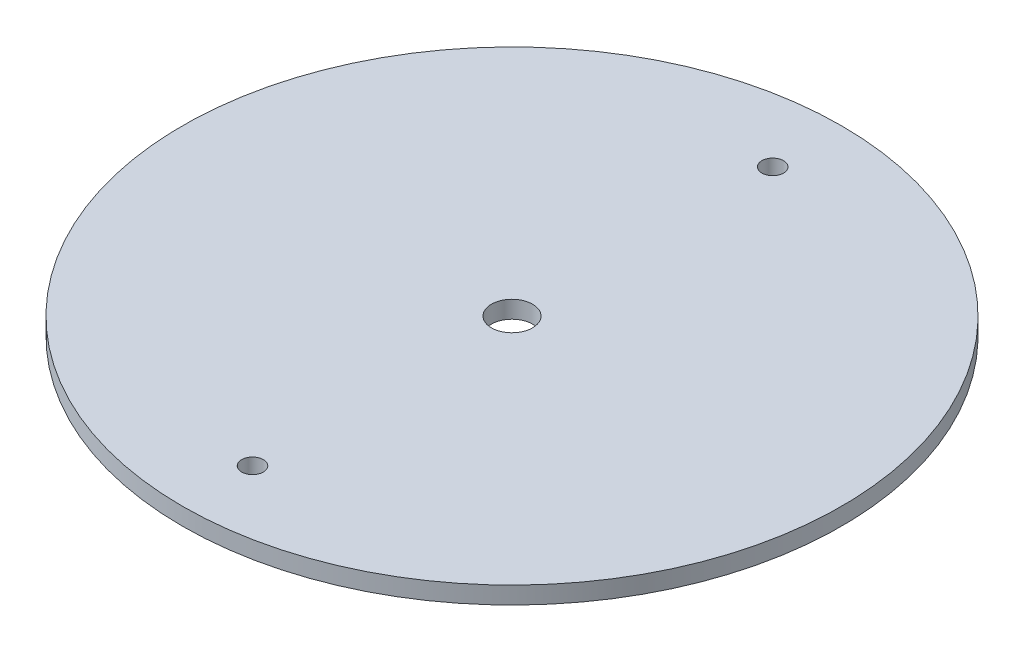
ISO-10303-21;
HEADER;
FILE_DESCRIPTION(('STEP AP214'),'2;1');
FILE_NAME('part.step','',(''),(''),'','','');
FILE_SCHEMA(('AUTOMOTIVE_DESIGN { 1 0 10303 214 1 1 1 1 }'));
ENDSEC;
DATA;
#1=APPLICATION_CONTEXT('core data for automotive mechanical design processes');
#2=APPLICATION_PROTOCOL_DEFINITION('international standard','automotive_design',2000,#1);
#3=PRODUCT_CONTEXT('',#1,'mechanical');
#4=PRODUCT('Part','Part','',(#3));
#5=PRODUCT_RELATED_PRODUCT_CATEGORY('part','',(#4));
#6=PRODUCT_DEFINITION_FORMATION('','',#4);
#7=PRODUCT_DEFINITION_CONTEXT('part definition',#1,'design');
#8=PRODUCT_DEFINITION('design','',#6,#7);
#9=PRODUCT_DEFINITION_SHAPE('','',#8);
#10=(LENGTH_UNIT() NAMED_UNIT(*) SI_UNIT(.MILLI.,.METRE.));
#11=(NAMED_UNIT(*) PLANE_ANGLE_UNIT() SI_UNIT($,.RADIAN.));
#12=(NAMED_UNIT(*) SI_UNIT($,.STERADIAN.) SOLID_ANGLE_UNIT());
#13=UNCERTAINTY_MEASURE_WITH_UNIT(LENGTH_MEASURE(1.E-05),#10,'distance_accuracy_value','');
#14=(GEOMETRIC_REPRESENTATION_CONTEXT(3) GLOBAL_UNCERTAINTY_ASSIGNED_CONTEXT((#13)) GLOBAL_UNIT_ASSIGNED_CONTEXT((#10,
#11,#12)) REPRESENTATION_CONTEXT('',''));
#15=CARTESIAN_POINT('',(0.,0.,0.));
#16=DIRECTION('',(0.,0.,1.));
#17=DIRECTION('',(1.,0.,0.));
#18=AXIS2_PLACEMENT_3D('',#15,#16,#17);
#19=CARTESIAN_POINT('',(0.,4.,0.));
#20=DIRECTION('',(0.,1.,0.));
#21=DIRECTION('',(0.,0.,1.));
#22=AXIS2_PLACEMENT_3D('',#19,#20,#21);
#23=PLANE('',#22);
#24=CARTESIAN_POINT('',(0.,4.,60.));
#25=DIRECTION('',(0.,1.,0.));
#26=DIRECTION('',(0.,0.,1.));
#27=AXIS2_PLACEMENT_3D('',#24,#25,#26);
#28=CIRCLE('',#27,2.5);
#29=CARTESIAN_POINT('',(0.,4.,62.5));
#30=VERTEX_POINT('',#29);
#31=EDGE_CURVE('E68',#30,#30,#28,.T.);
#32=ORIENTED_EDGE('',*,*,#31,.F.);
#33=EDGE_LOOP('',(#32));
#34=FACE_BOUND('',#33,.T.);
#35=CARTESIAN_POINT('',(0.277786929518062,4.,-59.999356950069));
#36=DIRECTION('',(0.,1.,0.));
#37=DIRECTION('',(0.,0.,1.));
#38=AXIS2_PLACEMENT_3D('',#35,#36,#37);
#39=CIRCLE('',#38,2.5);
#40=CARTESIAN_POINT('',(0.277786929518062,4.,-57.499356950069));
#41=VERTEX_POINT('',#40);
#42=EDGE_CURVE('E69',#41,#41,#39,.T.);
#43=ORIENTED_EDGE('',*,*,#42,.F.);
#44=EDGE_LOOP('',(#43));
#45=FACE_BOUND('',#44,.T.);
#46=CARTESIAN_POINT('',(0.,4.,0.));
#47=DIRECTION('',(0.,1.,0.));
#48=DIRECTION('',(0.,0.,1.));
#49=AXIS2_PLACEMENT_3D('',#46,#47,#48);
#50=CIRCLE('',#49,76.2);
#51=CARTESIAN_POINT('',(0.,4.,76.2));
#52=VERTEX_POINT('',#51);
#53=EDGE_CURVE('E10',#52,#52,#50,.T.);
#54=ORIENTED_EDGE('',*,*,#53,.T.);
#55=EDGE_LOOP('',(#54));
#56=FACE_BOUND('',#55,.T.);
#57=CARTESIAN_POINT('',(0.,4.,0.));
#58=DIRECTION('',(0.,1.,0.));
#59=DIRECTION('',(0.,0.,1.));
#60=AXIS2_PLACEMENT_3D('',#57,#58,#59);
#61=CIRCLE('',#60,4.75);
#62=CARTESIAN_POINT('',(0.,4.,4.75));
#63=VERTEX_POINT('',#62);
#64=EDGE_CURVE('E54',#63,#63,#61,.T.);
#65=ORIENTED_EDGE('',*,*,#64,.F.);
#66=EDGE_LOOP('',(#65));
#67=FACE_BOUND('',#66,.T.);
#68=ADVANCED_FACE('F41',(#34,#45,#56,#67),#23,.T.);
#69=CARTESIAN_POINT('',(0.,0.,0.));
#70=DIRECTION('',(0.,1.,0.));
#71=DIRECTION('',(0.,0.,1.));
#72=AXIS2_PLACEMENT_3D('',#69,#70,#71);
#73=PLANE('',#72);
#74=CARTESIAN_POINT('',(0.,0.,60.));
#75=DIRECTION('',(0.,1.,0.));
#76=DIRECTION('',(0.,0.,1.));
#77=AXIS2_PLACEMENT_3D('',#74,#75,#76);
#78=CIRCLE('',#77,2.5);
#79=CARTESIAN_POINT('',(0.,0.,62.5));
#80=VERTEX_POINT('',#79);
#81=EDGE_CURVE('E60',#80,#80,#78,.F.);
#82=ORIENTED_EDGE('',*,*,#81,.F.);
#83=EDGE_LOOP('',(#82));
#84=FACE_BOUND('',#83,.T.);
#85=CARTESIAN_POINT('',(0.277786929518062,0.,-59.999356950069));
#86=DIRECTION('',(0.,1.,0.));
#87=DIRECTION('',(0.,0.,1.));
#88=AXIS2_PLACEMENT_3D('',#85,#86,#87);
#89=CIRCLE('',#88,2.5);
#90=CARTESIAN_POINT('',(0.277786929518062,0.,-57.499356950069));
#91=VERTEX_POINT('',#90);
#92=EDGE_CURVE('E64',#91,#91,#89,.F.);
#93=ORIENTED_EDGE('',*,*,#92,.F.);
#94=EDGE_LOOP('',(#93));
#95=FACE_BOUND('',#94,.T.);
#96=CARTESIAN_POINT('',(0.,0.,0.));
#97=DIRECTION('',(0.,1.,0.));
#98=DIRECTION('',(0.,0.,1.));
#99=AXIS2_PLACEMENT_3D('',#96,#97,#98);
#100=CIRCLE('',#99,76.2);
#101=CARTESIAN_POINT('',(0.,0.,76.2));
#102=VERTEX_POINT('',#101);
#103=EDGE_CURVE('E45',#102,#102,#100,.T.);
#104=ORIENTED_EDGE('',*,*,#103,.F.);
#105=EDGE_LOOP('',(#104));
#106=FACE_BOUND('',#105,.T.);
#107=CARTESIAN_POINT('',(0.,0.,0.));
#108=DIRECTION('',(0.,1.,0.));
#109=DIRECTION('',(0.,0.,1.));
#110=AXIS2_PLACEMENT_3D('',#107,#108,#109);
#111=CIRCLE('',#110,4.75);
#112=CARTESIAN_POINT('',(0.,0.,4.75));
#113=VERTEX_POINT('',#112);
#114=EDGE_CURVE('E56',#113,#113,#111,.T.);
#115=ORIENTED_EDGE('',*,*,#114,.T.);
#116=EDGE_LOOP('',(#115));
#117=FACE_BOUND('',#116,.T.);
#118=ADVANCED_FACE('F85',(#84,#95,#106,#117),#73,.F.);
#119=CARTESIAN_POINT('',(0.,4.,0.));
#120=DIRECTION('',(0.,-1.,0.));
#121=DIRECTION('',(0.,0.,-1.));
#122=AXIS2_PLACEMENT_3D('',#119,#120,#121);
#123=CYLINDRICAL_SURFACE('',#122,76.2);
#124=ORIENTED_EDGE('',*,*,#53,.F.);
#125=EDGE_LOOP('',(#124));
#126=FACE_BOUND('',#125,.T.);
#127=ORIENTED_EDGE('',*,*,#103,.T.);
#128=EDGE_LOOP('',(#127));
#129=FACE_BOUND('',#128,.T.);
#130=ADVANCED_FACE('F43',(#126,#129),#123,.T.);
#131=CARTESIAN_POINT('',(0.,4.,0.));
#132=DIRECTION('',(0.,-1.,0.));
#133=DIRECTION('',(0.,0.,-1.));
#134=AXIS2_PLACEMENT_3D('',#131,#132,#133);
#135=CYLINDRICAL_SURFACE('',#134,4.75);
#136=ORIENTED_EDGE('',*,*,#64,.T.);
#137=EDGE_LOOP('',(#136));
#138=FACE_BOUND('',#137,.T.);
#139=ORIENTED_EDGE('',*,*,#114,.F.);
#140=EDGE_LOOP('',(#139));
#141=FACE_BOUND('',#140,.T.);
#142=ADVANCED_FACE('F91',(#138,#141),#135,.F.);
#143=CARTESIAN_POINT('',(0.277786929518062,-0.00100000000000013,-59.999356950069));
#144=DIRECTION('',(0.,1.,0.));
#145=DIRECTION('',(0.,0.,1.));
#146=AXIS2_PLACEMENT_3D('',#143,#144,#145);
#147=CYLINDRICAL_SURFACE('',#146,2.5);
#148=ORIENTED_EDGE('',*,*,#42,.T.);
#149=EDGE_LOOP('',(#148));
#150=FACE_BOUND('',#149,.T.);
#151=ORIENTED_EDGE('',*,*,#92,.T.);
#152=EDGE_LOOP('',(#151));
#153=FACE_BOUND('',#152,.T.);
#154=ADVANCED_FACE('F94',(#150,#153),#147,.F.);
#155=CARTESIAN_POINT('',(0.,-0.00100000000000013,60.));
#156=DIRECTION('',(0.,1.,0.));
#157=DIRECTION('',(0.,0.,1.));
#158=AXIS2_PLACEMENT_3D('',#155,#156,#157);
#159=CYLINDRICAL_SURFACE('',#158,2.5);
#160=ORIENTED_EDGE('',*,*,#31,.T.);
#161=EDGE_LOOP('',(#160));
#162=FACE_BOUND('',#161,.T.);
#163=ORIENTED_EDGE('',*,*,#81,.T.);
#164=EDGE_LOOP('',(#163));
#165=FACE_BOUND('',#164,.T.);
#166=ADVANCED_FACE('F80',(#162,#165),#159,.F.);
#167=CLOSED_SHELL('',(#68,#118,#130,#142,#154,#166));
#168=MANIFOLD_SOLID_BREP('B2',#167);
#169=ADVANCED_BREP_SHAPE_REPRESENTATION('',(#18,#168),#14);
#170=SHAPE_DEFINITION_REPRESENTATION(#9,#169);
ENDSEC;
END-ISO-10303-21;
